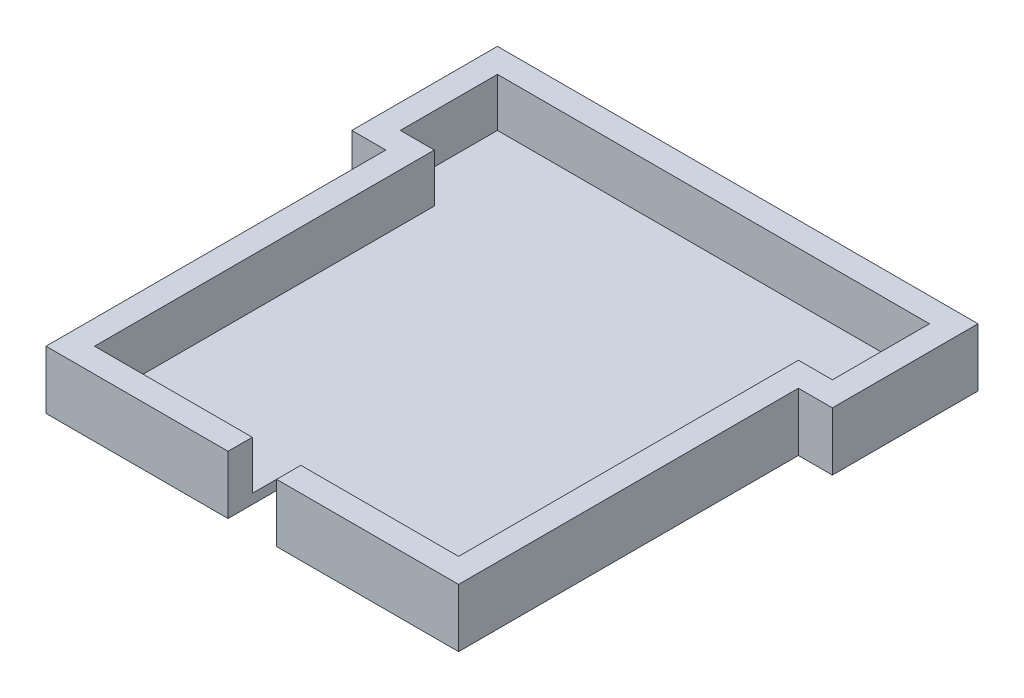
ISO-10303-21;
HEADER;
FILE_DESCRIPTION(('STEP AP214'),'2;1');
FILE_NAME('part.step','',(''),(''),'','','');
FILE_SCHEMA(('AUTOMOTIVE_DESIGN { 1 0 10303 214 1 1 1 1 }'));
ENDSEC;
DATA;
#1=APPLICATION_CONTEXT('core data for automotive mechanical design processes');
#2=APPLICATION_PROTOCOL_DEFINITION('international standard','automotive_design',2000,#1);
#3=PRODUCT_CONTEXT('',#1,'mechanical');
#4=PRODUCT('Part','Part','',(#3));
#5=PRODUCT_RELATED_PRODUCT_CATEGORY('part','',(#4));
#6=PRODUCT_DEFINITION_FORMATION('','',#4);
#7=PRODUCT_DEFINITION_CONTEXT('part definition',#1,'design');
#8=PRODUCT_DEFINITION('design','',#6,#7);
#9=PRODUCT_DEFINITION_SHAPE('','',#8);
#10=(LENGTH_UNIT() NAMED_UNIT(*) SI_UNIT(.MILLI.,.METRE.));
#11=(NAMED_UNIT(*) PLANE_ANGLE_UNIT() SI_UNIT($,.RADIAN.));
#12=(NAMED_UNIT(*) SI_UNIT($,.STERADIAN.) SOLID_ANGLE_UNIT());
#13=UNCERTAINTY_MEASURE_WITH_UNIT(LENGTH_MEASURE(1.E-05),#10,'distance_accuracy_value','');
#14=(GEOMETRIC_REPRESENTATION_CONTEXT(3) GLOBAL_UNCERTAINTY_ASSIGNED_CONTEXT((#13)) GLOBAL_UNIT_ASSIGNED_CONTEXT((#10,
#11,#12)) REPRESENTATION_CONTEXT('',''));
#15=CARTESIAN_POINT('',(0.,0.,0.));
#16=DIRECTION('',(0.,0.,1.));
#17=DIRECTION('',(1.,0.,0.));
#18=AXIS2_PLACEMENT_3D('',#15,#16,#17);
#19=CARTESIAN_POINT('',(25.5836159765002,12.,-20.1110429457402));
#20=DIRECTION('',(0.,0.,-1.));
#21=DIRECTION('',(-1.,0.,0.));
#22=AXIS2_PLACEMENT_3D('',#19,#20,#21);
#23=PLANE('',#22);
#24=DIRECTION('',(0.,1.,0.));
#25=VECTOR('',#24,1.);
#26=CARTESIAN_POINT('',(63.0836159765002,0.,-20.1110429457402));
#27=LINE('',#26,#25);
#28=CARTESIAN_POINT('',(63.0836159765002,0.,-20.1110429457402));
#29=VERTEX_POINT('',#28);
#30=CARTESIAN_POINT('',(63.0836159765002,12.,-20.1110429457402));
#31=VERTEX_POINT('',#30);
#32=EDGE_CURVE('E204',#29,#31,#27,.T.);
#33=ORIENTED_EDGE('',*,*,#32,.T.);
#34=DIRECTION('',(1.,0.,0.));
#35=VECTOR('',#34,1.);
#36=CARTESIAN_POINT('',(25.5836159765002,12.,-20.1110429457402));
#37=LINE('',#36,#35);
#38=CARTESIAN_POINT('',(25.5836159765002,12.,-20.1110429457402));
#39=VERTEX_POINT('',#38);
#40=EDGE_CURVE('E312',#39,#31,#37,.T.);
#41=ORIENTED_EDGE('',*,*,#40,.F.);
#42=DIRECTION('',(0.,-1.,0.));
#43=VECTOR('',#42,1.);
#44=CARTESIAN_POINT('',(25.5836159765002,12.,-20.1110429457402));
#45=LINE('',#44,#43);
#46=CARTESIAN_POINT('',(25.5836159765002,0.,-20.1110429457402));
#47=VERTEX_POINT('',#46);
#48=EDGE_CURVE('E379',#39,#47,#45,.T.);
#49=ORIENTED_EDGE('',*,*,#48,.T.);
#50=DIRECTION('',(1.,0.,0.));
#51=VECTOR('',#50,1.);
#52=CARTESIAN_POINT('',(25.5836159765002,0.,-20.1110429457402));
#53=LINE('',#52,#51);
#54=EDGE_CURVE('E338',#47,#29,#53,.T.);
#55=ORIENTED_EDGE('',*,*,#54,.T.);
#56=EDGE_LOOP('',(#33,#41,#49,#55));
#57=FACE_BOUND('',#56,.T.);
#58=ADVANCED_FACE('F45',(#57),#23,.F.);
#59=CARTESIAN_POINT('',(30.5836159765002,12.,-25.1110429457402));
#60=DIRECTION('',(0.,0.,-1.));
#61=DIRECTION('',(-1.,0.,0.));
#62=AXIS2_PLACEMENT_3D('',#59,#60,#61);
#63=PLANE('',#62);
#64=DIRECTION('',(1.,0.,0.));
#65=VECTOR('',#64,1.);
#66=CARTESIAN_POINT('',(30.5836159765002,12.,-25.1110429457402));
#67=LINE('',#66,#65);
#68=CARTESIAN_POINT('',(30.5836159765002,12.,-25.1110429457402));
#69=VERTEX_POINT('',#68);
#70=CARTESIAN_POINT('',(63.0836159765002,12.,-25.1110429457402));
#71=VERTEX_POINT('',#70);
#72=EDGE_CURVE('E247',#69,#71,#67,.T.);
#73=ORIENTED_EDGE('',*,*,#72,.T.);
#74=DIRECTION('',(0.,-1.,0.));
#75=VECTOR('',#74,1.);
#76=CARTESIAN_POINT('',(63.0836159765002,12.,-25.1110429457402));
#77=LINE('',#76,#75);
#78=CARTESIAN_POINT('',(63.0836159765002,2.,-25.1110429457402));
#79=VERTEX_POINT('',#78);
#80=EDGE_CURVE('E230',#71,#79,#77,.T.);
#81=ORIENTED_EDGE('',*,*,#80,.T.);
#82=DIRECTION('',(1.,0.,0.));
#83=VECTOR('',#82,1.);
#84=CARTESIAN_POINT('',(30.5836159765002,2.,-25.1110429457402));
#85=LINE('',#84,#83);
#86=CARTESIAN_POINT('',(30.5836159765002,2.,-25.1110429457402));
#87=VERTEX_POINT('',#86);
#88=EDGE_CURVE('E54',#87,#79,#85,.T.);
#89=ORIENTED_EDGE('',*,*,#88,.F.);
#90=DIRECTION('',(0.,-1.,0.));
#91=VECTOR('',#90,1.);
#92=CARTESIAN_POINT('',(30.5836159765002,12.,-25.1110429457402));
#93=LINE('',#92,#91);
#94=EDGE_CURVE('E298',#69,#87,#93,.T.);
#95=ORIENTED_EDGE('',*,*,#94,.F.);
#96=EDGE_LOOP('',(#73,#81,#89,#95));
#97=FACE_BOUND('',#96,.T.);
#98=ADVANCED_FACE('F474',(#97),#63,.T.);
#99=CARTESIAN_POINT('',(0.,2.,0.));
#100=DIRECTION('',(0.,1.,0.));
#101=DIRECTION('',(0.,0.,1.));
#102=AXIS2_PLACEMENT_3D('',#99,#100,#101);
#103=PLANE('',#102);
#104=DIRECTION('',(0.,0.,-1.));
#105=VECTOR('',#104,1.);
#106=CARTESIAN_POINT('',(73.0836159765002,2.,0.));
#107=LINE('',#106,#105);
#108=CARTESIAN_POINT('',(73.0836159765002,2.,-25.1110429457402));
#109=VERTEX_POINT('',#108);
#110=CARTESIAN_POINT('',(73.0836159765002,2.,-32.1110429457402));
#111=VERTEX_POINT('',#110);
#112=EDGE_CURVE('E200',#109,#111,#107,.T.);
#113=ORIENTED_EDGE('',*,*,#112,.F.);
#114=CARTESIAN_POINT('',(105.5836159765,2.,-25.1110429457402));
#115=VERTEX_POINT('',#114);
#116=EDGE_CURVE('E406',#109,#115,#85,.T.);
#117=ORIENTED_EDGE('',*,*,#116,.T.);
#118=DIRECTION('',(0.,0.,1.));
#119=VECTOR('',#118,1.);
#120=CARTESIAN_POINT('',(105.5836159765,2.,-95.1110429457402));
#121=LINE('',#120,#119);
#122=CARTESIAN_POINT('',(105.5836159765,2.,-95.1110429457402));
#123=VERTEX_POINT('',#122);
#124=EDGE_CURVE('E403',#123,#115,#121,.T.);
#125=ORIENTED_EDGE('',*,*,#124,.F.);
#126=DIRECTION('',(-1.,0.,0.));
#127=VECTOR('',#126,1.);
#128=CARTESIAN_POINT('',(112.5836159765,2.,-95.1110429457402));
#129=LINE('',#128,#127);
#130=CARTESIAN_POINT('',(112.5836159765,2.,-95.1110429457402));
#131=VERTEX_POINT('',#130);
#132=EDGE_CURVE('E399',#131,#123,#129,.T.);
#133=ORIENTED_EDGE('',*,*,#132,.F.);
#134=DIRECTION('',(0.,0.,1.));
#135=VECTOR('',#134,1.);
#136=CARTESIAN_POINT('',(112.5836159765,2.,-115.11104294574));
#137=LINE('',#136,#135);
#138=CARTESIAN_POINT('',(112.5836159765,2.,-115.11104294574));
#139=VERTEX_POINT('',#138);
#140=EDGE_CURVE('E395',#139,#131,#137,.T.);
#141=ORIENTED_EDGE('',*,*,#140,.F.);
#142=DIRECTION('',(-1.,0.,0.));
#143=VECTOR('',#142,1.);
#144=CARTESIAN_POINT('',(112.5836159765,2.,-115.11104294574));
#145=LINE('',#144,#143);
#146=CARTESIAN_POINT('',(23.5836159765002,2.,-115.11104294574));
#147=VERTEX_POINT('',#146);
#148=EDGE_CURVE('E392',#139,#147,#145,.T.);
#149=ORIENTED_EDGE('',*,*,#148,.T.);
#150=DIRECTION('',(0.,0.,1.));
#151=VECTOR('',#150,1.);
#152=CARTESIAN_POINT('',(23.5836159765002,2.,-115.11104294574));
#153=LINE('',#152,#151);
#154=CARTESIAN_POINT('',(23.5836159765002,2.,-95.1110429457402));
#155=VERTEX_POINT('',#154);
#156=EDGE_CURVE('E389',#147,#155,#153,.T.);
#157=ORIENTED_EDGE('',*,*,#156,.T.);
#158=DIRECTION('',(-1.,0.,0.));
#159=VECTOR('',#158,1.);
#160=CARTESIAN_POINT('',(30.5836159765002,2.,-95.1110429457402));
#161=LINE('',#160,#159);
#162=CARTESIAN_POINT('',(30.5836159765002,2.,-95.1110429457402));
#163=VERTEX_POINT('',#162);
#164=EDGE_CURVE('E68',#163,#155,#161,.T.);
#165=ORIENTED_EDGE('',*,*,#164,.F.);
#166=DIRECTION('',(0.,0.,1.));
#167=VECTOR('',#166,1.);
#168=CARTESIAN_POINT('',(30.5836159765002,2.,-95.1110429457402));
#169=LINE('',#168,#167);
#170=EDGE_CURVE('E11',#163,#87,#169,.T.);
#171=ORIENTED_EDGE('',*,*,#170,.T.);
#172=ORIENTED_EDGE('',*,*,#88,.T.);
#173=DIRECTION('',(0.,0.,-1.));
#174=VECTOR('',#173,1.);
#175=CARTESIAN_POINT('',(63.0836159765002,2.,0.));
#176=LINE('',#175,#174);
#177=CARTESIAN_POINT('',(63.0836159765002,2.,-32.1110429457402));
#178=VERTEX_POINT('',#177);
#179=EDGE_CURVE('E234',#79,#178,#176,.T.);
#180=ORIENTED_EDGE('',*,*,#179,.T.);
#181=DIRECTION('',(1.,0.,0.));
#182=VECTOR('',#181,1.);
#183=CARTESIAN_POINT('',(0.,2.,-32.1110429457402));
#184=LINE('',#183,#182);
#185=EDGE_CURVE('E222',#178,#111,#184,.T.);
#186=ORIENTED_EDGE('',*,*,#185,.T.);
#187=EDGE_LOOP('',(#113,#117,#125,#133,#141,#149,#157,#165,#171,#172,#180,#186));
#188=FACE_BOUND('',#187,.T.);
#189=ADVANCED_FACE('F412',(#188),#103,.T.);
#190=CARTESIAN_POINT('',(0.,12.,0.));
#191=DIRECTION('',(0.,1.,0.));
#192=DIRECTION('',(0.,0.,1.));
#193=AXIS2_PLACEMENT_3D('',#190,#191,#192);
#194=PLANE('',#193);
#195=DIRECTION('',(0.,0.,1.));
#196=VECTOR('',#195,1.);
#197=CARTESIAN_POINT('',(73.0836159765002,12.,-32.1110429457402));
#198=LINE('',#197,#196);
#199=CARTESIAN_POINT('',(73.0836159765002,12.,-25.1110429457402));
#200=VERTEX_POINT('',#199);
#201=CARTESIAN_POINT('',(73.0836159765002,12.,-20.1110429457402));
#202=VERTEX_POINT('',#201);
#203=EDGE_CURVE('E216',#200,#202,#198,.T.);
#204=ORIENTED_EDGE('',*,*,#203,.T.);
#205=CARTESIAN_POINT('',(110.5836159765,12.,-20.1110429457402));
#206=VERTEX_POINT('',#205);
#207=EDGE_CURVE('E311',#202,#206,#37,.T.);
#208=ORIENTED_EDGE('',*,*,#207,.T.);
#209=DIRECTION('',(0.,0.,-1.));
#210=VECTOR('',#209,1.);
#211=CARTESIAN_POINT('',(110.5836159765,12.,-90.1110429457402));
#212=LINE('',#211,#210);
#213=CARTESIAN_POINT('',(110.5836159765,12.,-90.1110429457402));
#214=VERTEX_POINT('',#213);
#215=EDGE_CURVE('E316',#206,#214,#212,.T.);
#216=ORIENTED_EDGE('',*,*,#215,.T.);
#217=DIRECTION('',(1.,0.,0.));
#218=VECTOR('',#217,1.);
#219=CARTESIAN_POINT('',(117.5836159765,12.,-90.1110429457402));
#220=LINE('',#219,#218);
#221=CARTESIAN_POINT('',(117.5836159765,12.,-90.1110429457402));
#222=VERTEX_POINT('',#221);
#223=EDGE_CURVE('E319',#214,#222,#220,.T.);
#224=ORIENTED_EDGE('',*,*,#223,.T.);
#225=DIRECTION('',(0.,0.,-1.));
#226=VECTOR('',#225,1.);
#227=CARTESIAN_POINT('',(117.5836159765,12.,-120.11104294574));
#228=LINE('',#227,#226);
#229=CARTESIAN_POINT('',(117.5836159765,12.,-120.11104294574));
#230=VERTEX_POINT('',#229);
#231=EDGE_CURVE('E322',#222,#230,#228,.T.);
#232=ORIENTED_EDGE('',*,*,#231,.T.);
#233=DIRECTION('',(-1.,0.,0.));
#234=VECTOR('',#233,1.);
#235=CARTESIAN_POINT('',(117.5836159765,12.,-120.11104294574));
#236=LINE('',#235,#234);
#237=CARTESIAN_POINT('',(18.5836159765002,12.,-120.11104294574));
#238=VERTEX_POINT('',#237);
#239=EDGE_CURVE('E325',#230,#238,#236,.T.);
#240=ORIENTED_EDGE('',*,*,#239,.T.);
#241=DIRECTION('',(0.,0.,1.));
#242=VECTOR('',#241,1.);
#243=CARTESIAN_POINT('',(18.5836159765002,12.,-120.11104294574));
#244=LINE('',#243,#242);
#245=CARTESIAN_POINT('',(18.5836159765002,12.,-90.1110429457402));
#246=VERTEX_POINT('',#245);
#247=EDGE_CURVE('E328',#238,#246,#244,.T.);
#248=ORIENTED_EDGE('',*,*,#247,.T.);
#249=DIRECTION('',(1.,0.,0.));
#250=VECTOR('',#249,1.);
#251=CARTESIAN_POINT('',(25.5836159765002,12.,-90.1110429457402));
#252=LINE('',#251,#250);
#253=CARTESIAN_POINT('',(25.5836159765002,12.,-90.1110429457402));
#254=VERTEX_POINT('',#253);
#255=EDGE_CURVE('E303',#246,#254,#252,.T.);
#256=ORIENTED_EDGE('',*,*,#255,.T.);
#257=DIRECTION('',(0.,0.,1.));
#258=VECTOR('',#257,1.);
#259=CARTESIAN_POINT('',(25.5836159765002,12.,-90.1110429457402));
#260=LINE('',#259,#258);
#261=EDGE_CURVE('E307',#254,#39,#260,.T.);
#262=ORIENTED_EDGE('',*,*,#261,.T.);
#263=ORIENTED_EDGE('',*,*,#40,.T.);
#264=DIRECTION('',(0.,0.,1.));
#265=VECTOR('',#264,1.);
#266=CARTESIAN_POINT('',(63.0836159765002,12.,-32.1110429457402));
#267=LINE('',#266,#265);
#268=EDGE_CURVE('E224',#71,#31,#267,.T.);
#269=ORIENTED_EDGE('',*,*,#268,.F.);
#270=ORIENTED_EDGE('',*,*,#72,.F.);
#271=DIRECTION('',(0.,0.,1.));
#272=VECTOR('',#271,1.);
#273=CARTESIAN_POINT('',(30.5836159765002,12.,-95.1110429457402));
#274=LINE('',#273,#272);
#275=CARTESIAN_POINT('',(30.5836159765002,12.,-95.1110429457402));
#276=VERTEX_POINT('',#275);
#277=EDGE_CURVE('E243',#276,#69,#274,.T.);
#278=ORIENTED_EDGE('',*,*,#277,.F.);
#279=DIRECTION('',(1.,0.,0.));
#280=VECTOR('',#279,1.);
#281=CARTESIAN_POINT('',(30.5836159765002,12.,-95.1110429457402));
#282=LINE('',#281,#280);
#283=CARTESIAN_POINT('',(23.5836159765002,12.,-95.1110429457402));
#284=VERTEX_POINT('',#283);
#285=EDGE_CURVE('E267',#284,#276,#282,.T.);
#286=ORIENTED_EDGE('',*,*,#285,.F.);
#287=DIRECTION('',(0.,0.,1.));
#288=VECTOR('',#287,1.);
#289=CARTESIAN_POINT('',(23.5836159765002,12.,-115.11104294574));
#290=LINE('',#289,#288);
#291=CARTESIAN_POINT('',(23.5836159765002,12.,-115.11104294574));
#292=VERTEX_POINT('',#291);
#293=EDGE_CURVE('E263',#292,#284,#290,.T.);
#294=ORIENTED_EDGE('',*,*,#293,.F.);
#295=DIRECTION('',(-1.,0.,0.));
#296=VECTOR('',#295,1.);
#297=CARTESIAN_POINT('',(112.5836159765,12.,-115.11104294574));
#298=LINE('',#297,#296);
#299=CARTESIAN_POINT('',(112.5836159765,12.,-115.11104294574));
#300=VERTEX_POINT('',#299);
#301=EDGE_CURVE('E260',#300,#292,#298,.T.);
#302=ORIENTED_EDGE('',*,*,#301,.F.);
#303=DIRECTION('',(0.,0.,-1.));
#304=VECTOR('',#303,1.);
#305=CARTESIAN_POINT('',(112.5836159765,12.,-115.11104294574));
#306=LINE('',#305,#304);
#307=CARTESIAN_POINT('',(112.5836159765,12.,-95.1110429457402));
#308=VERTEX_POINT('',#307);
#309=EDGE_CURVE('E257',#308,#300,#306,.T.);
#310=ORIENTED_EDGE('',*,*,#309,.F.);
#311=DIRECTION('',(1.,0.,0.));
#312=VECTOR('',#311,1.);
#313=CARTESIAN_POINT('',(112.5836159765,12.,-95.1110429457402));
#314=LINE('',#313,#312);
#315=CARTESIAN_POINT('',(105.5836159765,12.,-95.1110429457402));
#316=VERTEX_POINT('',#315);
#317=EDGE_CURVE('E254',#316,#308,#314,.T.);
#318=ORIENTED_EDGE('',*,*,#317,.F.);
#319=DIRECTION('',(0.,0.,-1.));
#320=VECTOR('',#319,1.);
#321=CARTESIAN_POINT('',(105.5836159765,12.,-95.1110429457402));
#322=LINE('',#321,#320);
#323=CARTESIAN_POINT('',(105.5836159765,12.,-25.1110429457402));
#324=VERTEX_POINT('',#323);
#325=EDGE_CURVE('E251',#324,#316,#322,.T.);
#326=ORIENTED_EDGE('',*,*,#325,.F.);
#327=EDGE_CURVE('E246',#200,#324,#67,.T.);
#328=ORIENTED_EDGE('',*,*,#327,.F.);
#329=EDGE_LOOP('',(#204,#208,#216,#224,#232,#240,#248,#256,#262,#263,#269,#270,#278,#286,#294,
#302,#310,#318,#326,#328));
#330=FACE_BOUND('',#329,.T.);
#331=ADVANCED_FACE('F428',(#330),#194,.T.);
#332=CARTESIAN_POINT('',(25.5836159765002,12.,-90.1110429457402));
#333=DIRECTION('',(0.,0.,-1.));
#334=DIRECTION('',(-1.,0.,0.));
#335=AXIS2_PLACEMENT_3D('',#332,#333,#334);
#336=PLANE('',#335);
#337=DIRECTION('',(1.,0.,0.));
#338=VECTOR('',#337,1.);
#339=CARTESIAN_POINT('',(25.5836159765002,0.,-90.1110429457402));
#340=LINE('',#339,#338);
#341=CARTESIAN_POINT('',(18.5836159765002,0.,-90.1110429457402));
#342=VERTEX_POINT('',#341);
#343=CARTESIAN_POINT('',(25.5836159765002,0.,-90.1110429457402));
#344=VERTEX_POINT('',#343);
#345=EDGE_CURVE('E302',#342,#344,#340,.T.);
#346=ORIENTED_EDGE('',*,*,#345,.T.);
#347=DIRECTION('',(0.,-1.,0.));
#348=VECTOR('',#347,1.);
#349=CARTESIAN_POINT('',(25.5836159765002,12.,-90.1110429457402));
#350=LINE('',#349,#348);
#351=EDGE_CURVE('E383',#254,#344,#350,.T.);
#352=ORIENTED_EDGE('',*,*,#351,.F.);
#353=ORIENTED_EDGE('',*,*,#255,.F.);
#354=DIRECTION('',(0.,-1.,0.));
#355=VECTOR('',#354,1.);
#356=CARTESIAN_POINT('',(18.5836159765002,12.,-90.1110429457402));
#357=LINE('',#356,#355);
#358=EDGE_CURVE('E331',#246,#342,#357,.T.);
#359=ORIENTED_EDGE('',*,*,#358,.T.);
#360=EDGE_LOOP('',(#346,#352,#353,#359));
#361=FACE_BOUND('',#360,.T.);
#362=ADVANCED_FACE('F459',(#361),#336,.F.);
#363=CARTESIAN_POINT('',(25.5836159765002,12.,-90.1110429457402));
#364=DIRECTION('',(1.,0.,0.));
#365=DIRECTION('',(0.,0.,-1.));
#366=AXIS2_PLACEMENT_3D('',#363,#364,#365);
#367=PLANE('',#366);
#368=DIRECTION('',(0.,0.,1.));
#369=VECTOR('',#368,1.);
#370=CARTESIAN_POINT('',(25.5836159765002,0.,-90.1110429457402));
#371=LINE('',#370,#369);
#372=EDGE_CURVE('E335',#344,#47,#371,.T.);
#373=ORIENTED_EDGE('',*,*,#372,.T.);
#374=ORIENTED_EDGE('',*,*,#48,.F.);
#375=ORIENTED_EDGE('',*,*,#261,.F.);
#376=ORIENTED_EDGE('',*,*,#351,.T.);
#377=EDGE_LOOP('',(#373,#374,#375,#376));
#378=FACE_BOUND('',#377,.T.);
#379=ADVANCED_FACE('F462',(#378),#367,.F.);
#380=ORIENTED_EDGE('',*,*,#207,.F.);
#381=DIRECTION('',(0.,1.,0.));
#382=VECTOR('',#381,1.);
#383=CARTESIAN_POINT('',(73.0836159765002,0.,-20.1110429457402));
#384=LINE('',#383,#382);
#385=CARTESIAN_POINT('',(73.0836159765002,0.,-20.1110429457402));
#386=VERTEX_POINT('',#385);
#387=EDGE_CURVE('E658',#386,#202,#384,.T.);
#388=ORIENTED_EDGE('',*,*,#387,.F.);
#389=CARTESIAN_POINT('',(110.5836159765,0.,-20.1110429457402));
#390=VERTEX_POINT('',#389);
#391=EDGE_CURVE('E214',#386,#390,#53,.T.);
#392=ORIENTED_EDGE('',*,*,#391,.T.);
#393=DIRECTION('',(0.,-1.,0.));
#394=VECTOR('',#393,1.);
#395=CARTESIAN_POINT('',(110.5836159765,12.,-20.1110429457402));
#396=LINE('',#395,#394);
#397=EDGE_CURVE('E375',#206,#390,#396,.T.);
#398=ORIENTED_EDGE('',*,*,#397,.F.);
#399=EDGE_LOOP('',(#380,#388,#392,#398));
#400=FACE_BOUND('',#399,.T.);
#401=ADVANCED_FACE('F432',(#400),#23,.F.);
#402=CARTESIAN_POINT('',(110.5836159765,12.,-90.1110429457402));
#403=DIRECTION('',(-1.,0.,0.));
#404=DIRECTION('',(0.,0.,1.));
#405=AXIS2_PLACEMENT_3D('',#402,#403,#404);
#406=PLANE('',#405);
#407=DIRECTION('',(0.,0.,-1.));
#408=VECTOR('',#407,1.);
#409=CARTESIAN_POINT('',(110.5836159765,0.,-90.1110429457402));
#410=LINE('',#409,#408);
#411=CARTESIAN_POINT('',(110.5836159765,0.,-90.1110429457402));
#412=VERTEX_POINT('',#411);
#413=EDGE_CURVE('E342',#390,#412,#410,.T.);
#414=ORIENTED_EDGE('',*,*,#413,.T.);
#415=DIRECTION('',(0.,-1.,0.));
#416=VECTOR('',#415,1.);
#417=CARTESIAN_POINT('',(110.5836159765,12.,-90.1110429457402));
#418=LINE('',#417,#416);
#419=EDGE_CURVE('E371',#214,#412,#418,.T.);
#420=ORIENTED_EDGE('',*,*,#419,.F.);
#421=ORIENTED_EDGE('',*,*,#215,.F.);
#422=ORIENTED_EDGE('',*,*,#397,.T.);
#423=EDGE_LOOP('',(#414,#420,#421,#422));
#424=FACE_BOUND('',#423,.T.);
#425=ADVANCED_FACE('F434',(#424),#406,.F.);
#426=CARTESIAN_POINT('',(117.5836159765,12.,-90.1110429457402));
#427=DIRECTION('',(0.,0.,-1.));
#428=DIRECTION('',(-1.,0.,0.));
#429=AXIS2_PLACEMENT_3D('',#426,#427,#428);
#430=PLANE('',#429);
#431=DIRECTION('',(1.,0.,0.));
#432=VECTOR('',#431,1.);
#433=CARTESIAN_POINT('',(117.5836159765,0.,-90.1110429457402));
#434=LINE('',#433,#432);
#435=CARTESIAN_POINT('',(117.5836159765,0.,-90.1110429457402));
#436=VERTEX_POINT('',#435);
#437=EDGE_CURVE('E345',#412,#436,#434,.T.);
#438=ORIENTED_EDGE('',*,*,#437,.T.);
#439=DIRECTION('',(0.,-1.,0.));
#440=VECTOR('',#439,1.);
#441=CARTESIAN_POINT('',(117.5836159765,12.,-90.1110429457402));
#442=LINE('',#441,#440);
#443=EDGE_CURVE('E367',#222,#436,#442,.T.);
#444=ORIENTED_EDGE('',*,*,#443,.F.);
#445=ORIENTED_EDGE('',*,*,#223,.F.);
#446=ORIENTED_EDGE('',*,*,#419,.T.);
#447=EDGE_LOOP('',(#438,#444,#445,#446));
#448=FACE_BOUND('',#447,.T.);
#449=ADVANCED_FACE('F439',(#448),#430,.F.);
#450=CARTESIAN_POINT('',(117.5836159765,12.,-120.11104294574));
#451=DIRECTION('',(-1.,0.,0.));
#452=DIRECTION('',(0.,0.,1.));
#453=AXIS2_PLACEMENT_3D('',#450,#451,#452);
#454=PLANE('',#453);
#455=DIRECTION('',(0.,0.,-1.));
#456=VECTOR('',#455,1.);
#457=CARTESIAN_POINT('',(117.5836159765,0.,-120.11104294574));
#458=LINE('',#457,#456);
#459=CARTESIAN_POINT('',(117.5836159765,0.,-120.11104294574));
#460=VERTEX_POINT('',#459);
#461=EDGE_CURVE('E348',#436,#460,#458,.T.);
#462=ORIENTED_EDGE('',*,*,#461,.T.);
#463=DIRECTION('',(0.,-1.,0.));
#464=VECTOR('',#463,1.);
#465=CARTESIAN_POINT('',(117.5836159765,12.,-120.11104294574));
#466=LINE('',#465,#464);
#467=EDGE_CURVE('E363',#230,#460,#466,.T.);
#468=ORIENTED_EDGE('',*,*,#467,.F.);
#469=ORIENTED_EDGE('',*,*,#231,.F.);
#470=ORIENTED_EDGE('',*,*,#443,.T.);
#471=EDGE_LOOP('',(#462,#468,#469,#470));
#472=FACE_BOUND('',#471,.T.);
#473=ADVANCED_FACE('F445',(#472),#454,.F.);
#474=CARTESIAN_POINT('',(117.5836159765,12.,-120.11104294574));
#475=DIRECTION('',(0.,0.,1.));
#476=DIRECTION('',(1.,0.,0.));
#477=AXIS2_PLACEMENT_3D('',#474,#475,#476);
#478=PLANE('',#477);
#479=DIRECTION('',(-1.,0.,0.));
#480=VECTOR('',#479,1.);
#481=CARTESIAN_POINT('',(117.5836159765,0.,-120.11104294574));
#482=LINE('',#481,#480);
#483=CARTESIAN_POINT('',(18.5836159765002,0.,-120.11104294574));
#484=VERTEX_POINT('',#483);
#485=EDGE_CURVE('E351',#460,#484,#482,.T.);
#486=ORIENTED_EDGE('',*,*,#485,.T.);
#487=DIRECTION('',(0.,-1.,0.));
#488=VECTOR('',#487,1.);
#489=CARTESIAN_POINT('',(18.5836159765002,12.,-120.11104294574));
#490=LINE('',#489,#488);
#491=EDGE_CURVE('E359',#238,#484,#490,.T.);
#492=ORIENTED_EDGE('',*,*,#491,.F.);
#493=ORIENTED_EDGE('',*,*,#239,.F.);
#494=ORIENTED_EDGE('',*,*,#467,.T.);
#495=EDGE_LOOP('',(#486,#492,#493,#494));
#496=FACE_BOUND('',#495,.T.);
#497=ADVANCED_FACE('F449',(#496),#478,.F.);
#498=CARTESIAN_POINT('',(18.5836159765002,12.,-120.11104294574));
#499=DIRECTION('',(1.,0.,0.));
#500=DIRECTION('',(0.,0.,-1.));
#501=AXIS2_PLACEMENT_3D('',#498,#499,#500);
#502=PLANE('',#501);
#503=DIRECTION('',(0.,0.,1.));
#504=VECTOR('',#503,1.);
#505=CARTESIAN_POINT('',(18.5836159765002,0.,-120.11104294574));
#506=LINE('',#505,#504);
#507=EDGE_CURVE('E308',#484,#342,#506,.T.);
#508=ORIENTED_EDGE('',*,*,#507,.T.);
#509=ORIENTED_EDGE('',*,*,#358,.F.);
#510=ORIENTED_EDGE('',*,*,#247,.F.);
#511=ORIENTED_EDGE('',*,*,#491,.T.);
#512=EDGE_LOOP('',(#508,#509,#510,#511));
#513=FACE_BOUND('',#512,.T.);
#514=ADVANCED_FACE('F454',(#513),#502,.F.);
#515=CARTESIAN_POINT('',(30.5836159765002,12.,-95.1110429457402));
#516=DIRECTION('',(1.,0.,0.));
#517=DIRECTION('',(0.,0.,-1.));
#518=AXIS2_PLACEMENT_3D('',#515,#516,#517);
#519=PLANE('',#518);
#520=ORIENTED_EDGE('',*,*,#94,.T.);
#521=ORIENTED_EDGE('',*,*,#170,.F.);
#522=DIRECTION('',(0.,-1.,0.));
#523=VECTOR('',#522,1.);
#524=CARTESIAN_POINT('',(30.5836159765002,12.,-95.1110429457402));
#525=LINE('',#524,#523);
#526=EDGE_CURVE('E270',#276,#163,#525,.T.);
#527=ORIENTED_EDGE('',*,*,#526,.F.);
#528=ORIENTED_EDGE('',*,*,#277,.T.);
#529=EDGE_LOOP('',(#520,#521,#527,#528));
#530=FACE_BOUND('',#529,.T.);
#531=ADVANCED_FACE('F476',(#530),#519,.T.);
#532=DIRECTION('',(0.,-1.,0.));
#533=VECTOR('',#532,1.);
#534=CARTESIAN_POINT('',(73.0836159765002,12.,-25.1110429457402));
#535=LINE('',#534,#533);
#536=EDGE_CURVE('E238',#200,#109,#535,.T.);
#537=ORIENTED_EDGE('',*,*,#536,.F.);
#538=ORIENTED_EDGE('',*,*,#327,.T.);
#539=DIRECTION('',(0.,-1.,0.));
#540=VECTOR('',#539,1.);
#541=CARTESIAN_POINT('',(105.5836159765,12.,-25.1110429457402));
#542=LINE('',#541,#540);
#543=EDGE_CURVE('E294',#324,#115,#542,.T.);
#544=ORIENTED_EDGE('',*,*,#543,.T.);
#545=ORIENTED_EDGE('',*,*,#116,.F.);
#546=EDGE_LOOP('',(#537,#538,#544,#545));
#547=FACE_BOUND('',#546,.T.);
#548=ADVANCED_FACE('F420',(#547),#63,.T.);
#549=CARTESIAN_POINT('',(105.5836159765,12.,-95.1110429457402));
#550=DIRECTION('',(-1.,0.,0.));
#551=DIRECTION('',(0.,0.,1.));
#552=AXIS2_PLACEMENT_3D('',#549,#550,#551);
#553=PLANE('',#552);
#554=DIRECTION('',(0.,-1.,0.));
#555=VECTOR('',#554,1.);
#556=CARTESIAN_POINT('',(105.5836159765,12.,-95.1110429457402));
#557=LINE('',#556,#555);
#558=EDGE_CURVE('E290',#316,#123,#557,.T.);
#559=ORIENTED_EDGE('',*,*,#558,.T.);
#560=ORIENTED_EDGE('',*,*,#124,.T.);
#561=ORIENTED_EDGE('',*,*,#543,.F.);
#562=ORIENTED_EDGE('',*,*,#325,.T.);
#563=EDGE_LOOP('',(#559,#560,#561,#562));
#564=FACE_BOUND('',#563,.T.);
#565=ADVANCED_FACE('F417',(#564),#553,.T.);
#566=CARTESIAN_POINT('',(112.5836159765,12.,-95.1110429457402));
#567=DIRECTION('',(0.,0.,-1.));
#568=DIRECTION('',(-1.,0.,0.));
#569=AXIS2_PLACEMENT_3D('',#566,#567,#568);
#570=PLANE('',#569);
#571=DIRECTION('',(0.,-1.,0.));
#572=VECTOR('',#571,1.);
#573=CARTESIAN_POINT('',(112.5836159765,12.,-95.1110429457402));
#574=LINE('',#573,#572);
#575=EDGE_CURVE('E286',#308,#131,#574,.T.);
#576=ORIENTED_EDGE('',*,*,#575,.T.);
#577=ORIENTED_EDGE('',*,*,#132,.T.);
#578=ORIENTED_EDGE('',*,*,#558,.F.);
#579=ORIENTED_EDGE('',*,*,#317,.T.);
#580=EDGE_LOOP('',(#576,#577,#578,#579));
#581=FACE_BOUND('',#580,.T.);
#582=ADVANCED_FACE('F497',(#581),#570,.T.);
#583=CARTESIAN_POINT('',(112.5836159765,12.,-115.11104294574));
#584=DIRECTION('',(-1.,0.,0.));
#585=DIRECTION('',(0.,0.,1.));
#586=AXIS2_PLACEMENT_3D('',#583,#584,#585);
#587=PLANE('',#586);
#588=DIRECTION('',(0.,-1.,0.));
#589=VECTOR('',#588,1.);
#590=CARTESIAN_POINT('',(112.5836159765,12.,-115.11104294574));
#591=LINE('',#590,#589);
#592=EDGE_CURVE('E282',#300,#139,#591,.T.);
#593=ORIENTED_EDGE('',*,*,#592,.T.);
#594=ORIENTED_EDGE('',*,*,#140,.T.);
#595=ORIENTED_EDGE('',*,*,#575,.F.);
#596=ORIENTED_EDGE('',*,*,#309,.T.);
#597=EDGE_LOOP('',(#593,#594,#595,#596));
#598=FACE_BOUND('',#597,.T.);
#599=ADVANCED_FACE('F495',(#598),#587,.T.);
#600=CARTESIAN_POINT('',(112.5836159765,12.,-115.11104294574));
#601=DIRECTION('',(0.,0.,1.));
#602=DIRECTION('',(1.,0.,0.));
#603=AXIS2_PLACEMENT_3D('',#600,#601,#602);
#604=PLANE('',#603);
#605=DIRECTION('',(0.,-1.,0.));
#606=VECTOR('',#605,1.);
#607=CARTESIAN_POINT('',(23.5836159765002,12.,-115.11104294574));
#608=LINE('',#607,#606);
#609=EDGE_CURVE('E278',#292,#147,#608,.T.);
#610=ORIENTED_EDGE('',*,*,#609,.T.);
#611=ORIENTED_EDGE('',*,*,#148,.F.);
#612=ORIENTED_EDGE('',*,*,#592,.F.);
#613=ORIENTED_EDGE('',*,*,#301,.T.);
#614=EDGE_LOOP('',(#610,#611,#612,#613));
#615=FACE_BOUND('',#614,.T.);
#616=ADVANCED_FACE('F489',(#615),#604,.T.);
#617=CARTESIAN_POINT('',(23.5836159765002,12.,-115.11104294574));
#618=DIRECTION('',(1.,0.,0.));
#619=DIRECTION('',(0.,0.,-1.));
#620=AXIS2_PLACEMENT_3D('',#617,#618,#619);
#621=PLANE('',#620);
#622=DIRECTION('',(0.,-1.,0.));
#623=VECTOR('',#622,1.);
#624=CARTESIAN_POINT('',(23.5836159765002,12.,-95.1110429457402));
#625=LINE('',#624,#623);
#626=EDGE_CURVE('E274',#284,#155,#625,.T.);
#627=ORIENTED_EDGE('',*,*,#626,.T.);
#628=ORIENTED_EDGE('',*,*,#156,.F.);
#629=ORIENTED_EDGE('',*,*,#609,.F.);
#630=ORIENTED_EDGE('',*,*,#293,.T.);
#631=EDGE_LOOP('',(#627,#628,#629,#630));
#632=FACE_BOUND('',#631,.T.);
#633=ADVANCED_FACE('F486',(#632),#621,.T.);
#634=CARTESIAN_POINT('',(30.5836159765002,12.,-95.1110429457402));
#635=DIRECTION('',(0.,0.,-1.));
#636=DIRECTION('',(-1.,0.,0.));
#637=AXIS2_PLACEMENT_3D('',#634,#635,#636);
#638=PLANE('',#637);
#639=ORIENTED_EDGE('',*,*,#526,.T.);
#640=ORIENTED_EDGE('',*,*,#164,.T.);
#641=ORIENTED_EDGE('',*,*,#626,.F.);
#642=ORIENTED_EDGE('',*,*,#285,.T.);
#643=EDGE_LOOP('',(#639,#640,#641,#642));
#644=FACE_BOUND('',#643,.T.);
#645=ADVANCED_FACE('F482',(#644),#638,.T.);
#646=CARTESIAN_POINT('',(0.,0.,0.));
#647=DIRECTION('',(0.,1.,0.));
#648=DIRECTION('',(0.,0.,1.));
#649=AXIS2_PLACEMENT_3D('',#646,#647,#648);
#650=PLANE('',#649);
#651=ORIENTED_EDGE('',*,*,#391,.F.);
#652=DIRECTION('',(0.,0.,1.));
#653=VECTOR('',#652,1.);
#654=CARTESIAN_POINT('',(73.0836159765002,0.,-32.1110429457402));
#655=LINE('',#654,#653);
#656=CARTESIAN_POINT('',(73.0836159765002,0.,-32.1110429457402));
#657=VERTEX_POINT('',#656);
#658=EDGE_CURVE('E197',#657,#386,#655,.T.);
#659=ORIENTED_EDGE('',*,*,#658,.F.);
#660=DIRECTION('',(1.,0.,0.));
#661=VECTOR('',#660,1.);
#662=CARTESIAN_POINT('',(63.0836159765002,0.,-32.1110429457402));
#663=LINE('',#662,#661);
#664=CARTESIAN_POINT('',(63.0836159765002,0.,-32.1110429457402));
#665=VERTEX_POINT('',#664);
#666=EDGE_CURVE('E203',#665,#657,#663,.T.);
#667=ORIENTED_EDGE('',*,*,#666,.F.);
#668=DIRECTION('',(0.,0.,1.));
#669=VECTOR('',#668,1.);
#670=CARTESIAN_POINT('',(63.0836159765002,0.,-32.1110429457402));
#671=LINE('',#670,#669);
#672=EDGE_CURVE('E217',#665,#29,#671,.T.);
#673=ORIENTED_EDGE('',*,*,#672,.T.);
#674=ORIENTED_EDGE('',*,*,#54,.F.);
#675=ORIENTED_EDGE('',*,*,#372,.F.);
#676=ORIENTED_EDGE('',*,*,#345,.F.);
#677=ORIENTED_EDGE('',*,*,#507,.F.);
#678=ORIENTED_EDGE('',*,*,#485,.F.);
#679=ORIENTED_EDGE('',*,*,#461,.F.);
#680=ORIENTED_EDGE('',*,*,#437,.F.);
#681=ORIENTED_EDGE('',*,*,#413,.F.);
#682=EDGE_LOOP('',(#651,#659,#667,#673,#674,#675,#676,#677,#678,#679,#680,#681));
#683=FACE_BOUND('',#682,.T.);
#684=ADVANCED_FACE('F47',(#683),#650,.F.);
#685=CARTESIAN_POINT('',(73.0836159765002,0.,-32.1110429457402));
#686=DIRECTION('',(1.,0.,0.));
#687=DIRECTION('',(0.,0.,-1.));
#688=AXIS2_PLACEMENT_3D('',#685,#686,#687);
#689=PLANE('',#688);
#690=ORIENTED_EDGE('',*,*,#112,.T.);
#691=DIRECTION('',(0.,1.,0.));
#692=VECTOR('',#691,1.);
#693=CARTESIAN_POINT('',(73.0836159765002,0.,-32.1110429457402));
#694=LINE('',#693,#692);
#695=EDGE_CURVE('E194',#657,#111,#694,.T.);
#696=ORIENTED_EDGE('',*,*,#695,.F.);
#697=ORIENTED_EDGE('',*,*,#658,.T.);
#698=ORIENTED_EDGE('',*,*,#387,.T.);
#699=ORIENTED_EDGE('',*,*,#203,.F.);
#700=ORIENTED_EDGE('',*,*,#536,.T.);
#701=EDGE_LOOP('',(#690,#696,#697,#698,#699,#700));
#702=FACE_BOUND('',#701,.T.);
#703=ADVANCED_FACE('F195',(#702),#689,.F.);
#704=CARTESIAN_POINT('',(63.0836159765002,0.,-32.1110429457402));
#705=DIRECTION('',(1.,0.,0.));
#706=DIRECTION('',(0.,0.,-1.));
#707=AXIS2_PLACEMENT_3D('',#704,#705,#706);
#708=PLANE('',#707);
#709=ORIENTED_EDGE('',*,*,#80,.F.);
#710=ORIENTED_EDGE('',*,*,#268,.T.);
#711=ORIENTED_EDGE('',*,*,#32,.F.);
#712=ORIENTED_EDGE('',*,*,#672,.F.);
#713=DIRECTION('',(0.,1.,0.));
#714=VECTOR('',#713,1.);
#715=CARTESIAN_POINT('',(63.0836159765002,0.,-32.1110429457402));
#716=LINE('',#715,#714);
#717=EDGE_CURVE('E61',#665,#178,#716,.T.);
#718=ORIENTED_EDGE('',*,*,#717,.T.);
#719=ORIENTED_EDGE('',*,*,#179,.F.);
#720=EDGE_LOOP('',(#709,#710,#711,#712,#718,#719));
#721=FACE_BOUND('',#720,.T.);
#722=ADVANCED_FACE('F636',(#721),#708,.T.);
#723=CARTESIAN_POINT('',(0.,0.,-32.1110429457402));
#724=DIRECTION('',(0.,0.,1.));
#725=DIRECTION('',(1.,0.,0.));
#726=AXIS2_PLACEMENT_3D('',#723,#724,#725);
#727=PLANE('',#726);
#728=ORIENTED_EDGE('',*,*,#717,.F.);
#729=ORIENTED_EDGE('',*,*,#666,.T.);
#730=ORIENTED_EDGE('',*,*,#695,.T.);
#731=ORIENTED_EDGE('',*,*,#185,.F.);
#732=EDGE_LOOP('',(#728,#729,#730,#731));
#733=FACE_BOUND('',#732,.T.);
#734=ADVANCED_FACE('F207',(#733),#727,.T.);
#735=CLOSED_SHELL('',(#58,#98,#189,#331,#362,#379,#401,#425,#449,#473,#497,#514,#531,#548,#565,
#582,#599,#616,#633,#645,#684,#703,#722,#734));
#736=MANIFOLD_SOLID_BREP('B2',#735);
#737=ADVANCED_BREP_SHAPE_REPRESENTATION('',(#18,#736),#14);
#738=SHAPE_DEFINITION_REPRESENTATION(#9,#737);
ENDSEC;
END-ISO-10303-21;
